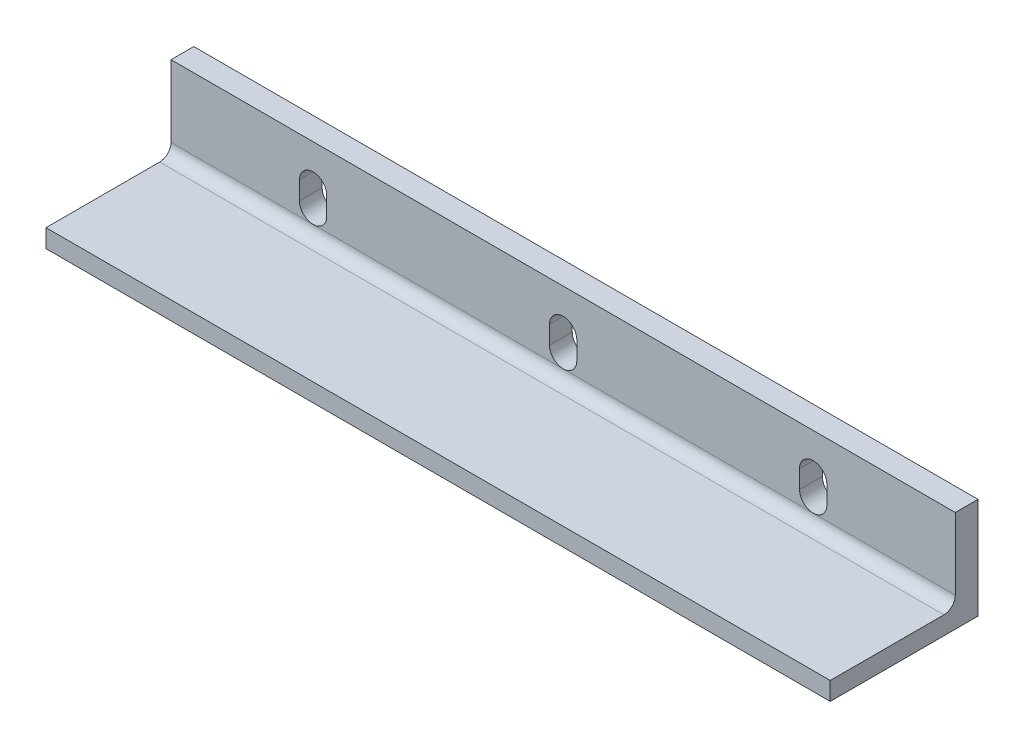
ISO-10303-21;
HEADER;
FILE_DESCRIPTION(('STEP AP214'),'2;1');
FILE_NAME('part.step','',(''),(''),'','','');
FILE_SCHEMA(('AUTOMOTIVE_DESIGN { 1 0 10303 214 1 1 1 1 }'));
ENDSEC;
DATA;
#1=APPLICATION_CONTEXT('core data for automotive mechanical design processes');
#2=APPLICATION_PROTOCOL_DEFINITION('international standard','automotive_design',2000,#1);
#3=PRODUCT_CONTEXT('',#1,'mechanical');
#4=PRODUCT('Part','Part','',(#3));
#5=PRODUCT_RELATED_PRODUCT_CATEGORY('part','',(#4));
#6=PRODUCT_DEFINITION_FORMATION('','',#4);
#7=PRODUCT_DEFINITION_CONTEXT('part definition',#1,'design');
#8=PRODUCT_DEFINITION('design','',#6,#7);
#9=PRODUCT_DEFINITION_SHAPE('','',#8);
#10=(LENGTH_UNIT() NAMED_UNIT(*) SI_UNIT(.MILLI.,.METRE.));
#11=(NAMED_UNIT(*) PLANE_ANGLE_UNIT() SI_UNIT($,.RADIAN.));
#12=(NAMED_UNIT(*) SI_UNIT($,.STERADIAN.) SOLID_ANGLE_UNIT());
#13=UNCERTAINTY_MEASURE_WITH_UNIT(LENGTH_MEASURE(1.E-05),#10,'distance_accuracy_value','');
#14=(GEOMETRIC_REPRESENTATION_CONTEXT(3) GLOBAL_UNCERTAINTY_ASSIGNED_CONTEXT((#13)) GLOBAL_UNIT_ASSIGNED_CONTEXT((#10,
#11,#12)) REPRESENTATION_CONTEXT('',''));
#15=CARTESIAN_POINT('',(0.,0.,0.));
#16=DIRECTION('',(0.,0.,1.));
#17=DIRECTION('',(1.,0.,0.));
#18=AXIS2_PLACEMENT_3D('',#15,#16,#17);
#19=CARTESIAN_POINT('',(-34.5,8.9,-4.5));
#20=DIRECTION('',(0.,0.,-1.));
#21=DIRECTION('',(-1.,0.,0.));
#22=AXIS2_PLACEMENT_3D('',#19,#20,#21);
#23=PLANE('',#22);
#24=DIRECTION('',(1.,0.,0.));
#25=VECTOR('',#24,1.);
#26=CARTESIAN_POINT('',(34.5,2.6,-4.5));
#27=LINE('',#26,#25);
#28=CARTESIAN_POINT('',(-34.5,2.6,-4.5));
#29=VERTEX_POINT('',#28);
#30=CARTESIAN_POINT('',(-22.,2.6,-4.5));
#31=VERTEX_POINT('',#30);
#32=EDGE_CURVE('E594',#29,#31,#27,.T.);
#33=ORIENTED_EDGE('',*,*,#32,.T.);
#34=CARTESIAN_POINT('',(-22.,3.8,-4.5));
#35=DIRECTION('',(0.,0.,1.));
#36=DIRECTION('',(1.,0.,0.));
#37=AXIS2_PLACEMENT_3D('',#34,#35,#36);
#38=CIRCLE('',#37,1.2);
#39=CARTESIAN_POINT('',(-23.2,3.8,-4.5));
#40=VERTEX_POINT('',#39);
#41=EDGE_CURVE('E425',#40,#31,#38,.T.);
#42=ORIENTED_EDGE('',*,*,#41,.F.);
#43=DIRECTION('',(0.,1.,0.));
#44=VECTOR('',#43,1.);
#45=CARTESIAN_POINT('',(-23.2,3.8,-4.5));
#46=LINE('',#45,#44);
#47=CARTESIAN_POINT('',(-23.2,5.4,-4.5));
#48=VERTEX_POINT('',#47);
#49=EDGE_CURVE('E418',#40,#48,#46,.T.);
#50=ORIENTED_EDGE('',*,*,#49,.T.);
#51=CARTESIAN_POINT('',(-22.,5.4,-4.5));
#52=DIRECTION('',(0.,0.,1.));
#53=DIRECTION('',(1.,0.,0.));
#54=AXIS2_PLACEMENT_3D('',#51,#52,#53);
#55=CIRCLE('',#54,1.2);
#56=CARTESIAN_POINT('',(-20.7999999999999,5.4,-4.5));
#57=VERTEX_POINT('',#56);
#58=EDGE_CURVE('E434',#57,#48,#55,.T.);
#59=ORIENTED_EDGE('',*,*,#58,.F.);
#60=DIRECTION('',(0.,1.,0.));
#61=VECTOR('',#60,1.);
#62=CARTESIAN_POINT('',(-20.7999999999999,3.8,-4.5));
#63=LINE('',#62,#61);
#64=CARTESIAN_POINT('',(-20.8,3.8,-4.5));
#65=VERTEX_POINT('',#64);
#66=EDGE_CURVE('E411',#65,#57,#63,.T.);
#67=ORIENTED_EDGE('',*,*,#66,.F.);
#68=EDGE_CURVE('E415',#31,#65,#38,.T.);
#69=ORIENTED_EDGE('',*,*,#68,.F.);
#70=CARTESIAN_POINT('',(0.,2.6,-4.5));
#71=VERTEX_POINT('',#70);
#72=EDGE_CURVE('E599',#31,#71,#27,.T.);
#73=ORIENTED_EDGE('',*,*,#72,.T.);
#74=CARTESIAN_POINT('',(0.,3.8,-4.5));
#75=DIRECTION('',(0.,0.,1.));
#76=DIRECTION('',(1.,0.,0.));
#77=AXIS2_PLACEMENT_3D('',#74,#75,#76);
#78=CIRCLE('',#77,1.2);
#79=CARTESIAN_POINT('',(-1.20000000000006,3.8,-4.5));
#80=VERTEX_POINT('',#79);
#81=EDGE_CURVE('E272',#80,#71,#78,.T.);
#82=ORIENTED_EDGE('',*,*,#81,.F.);
#83=DIRECTION('',(0.,1.,0.));
#84=VECTOR('',#83,1.);
#85=CARTESIAN_POINT('',(-1.2,3.8,-4.5));
#86=LINE('',#85,#84);
#87=CARTESIAN_POINT('',(-1.2,5.4,-4.5));
#88=VERTEX_POINT('',#87);
#89=EDGE_CURVE('E454',#80,#88,#86,.T.);
#90=ORIENTED_EDGE('',*,*,#89,.T.);
#91=CARTESIAN_POINT('',(0.,5.4,-4.5));
#92=DIRECTION('',(0.,0.,1.));
#93=DIRECTION('',(1.,0.,0.));
#94=AXIS2_PLACEMENT_3D('',#91,#92,#93);
#95=CIRCLE('',#94,1.2);
#96=CARTESIAN_POINT('',(1.20000000000006,5.4,-4.5));
#97=VERTEX_POINT('',#96);
#98=EDGE_CURVE('E474',#97,#88,#95,.T.);
#99=ORIENTED_EDGE('',*,*,#98,.F.);
#100=DIRECTION('',(0.,1.,0.));
#101=VECTOR('',#100,1.);
#102=CARTESIAN_POINT('',(1.20000000000006,3.8,-4.5));
#103=LINE('',#102,#101);
#104=CARTESIAN_POINT('',(1.2,3.8,-4.5));
#105=VERTEX_POINT('',#104);
#106=EDGE_CURVE('E444',#105,#97,#103,.T.);
#107=ORIENTED_EDGE('',*,*,#106,.F.);
#108=EDGE_CURVE('E13',#71,#105,#78,.T.);
#109=ORIENTED_EDGE('',*,*,#108,.F.);
#110=CARTESIAN_POINT('',(22.,2.6,-4.5));
#111=VERTEX_POINT('',#110);
#112=EDGE_CURVE('E623',#71,#111,#27,.T.);
#113=ORIENTED_EDGE('',*,*,#112,.T.);
#114=CARTESIAN_POINT('',(22.,3.80000000000001,-4.5));
#115=DIRECTION('',(0.,0.,1.));
#116=DIRECTION('',(1.,0.,0.));
#117=AXIS2_PLACEMENT_3D('',#114,#115,#116);
#118=CIRCLE('',#117,1.2);
#119=CARTESIAN_POINT('',(20.7999999999999,3.80000000000001,-4.5));
#120=VERTEX_POINT('',#119);
#121=EDGE_CURVE('E504',#120,#111,#118,.T.);
#122=ORIENTED_EDGE('',*,*,#121,.F.);
#123=DIRECTION('',(0.,1.,0.));
#124=VECTOR('',#123,1.);
#125=CARTESIAN_POINT('',(20.8,3.80000000000001,-4.5));
#126=LINE('',#125,#124);
#127=CARTESIAN_POINT('',(20.8,5.40000000000001,-4.5));
#128=VERTEX_POINT('',#127);
#129=EDGE_CURVE('E495',#120,#128,#126,.T.);
#130=ORIENTED_EDGE('',*,*,#129,.T.);
#131=CARTESIAN_POINT('',(22.,5.40000000000001,-4.5));
#132=DIRECTION('',(0.,0.,1.));
#133=DIRECTION('',(1.,0.,0.));
#134=AXIS2_PLACEMENT_3D('',#131,#132,#133);
#135=CIRCLE('',#134,1.2);
#136=CARTESIAN_POINT('',(23.2000000000001,5.40000000000001,-4.5));
#137=VERTEX_POINT('',#136);
#138=EDGE_CURVE('E520',#137,#128,#135,.T.);
#139=ORIENTED_EDGE('',*,*,#138,.F.);
#140=DIRECTION('',(0.,1.,0.));
#141=VECTOR('',#140,1.);
#142=CARTESIAN_POINT('',(23.2000000000001,3.80000000000001,-4.5));
#143=LINE('',#142,#141);
#144=CARTESIAN_POINT('',(23.2,3.80000000000001,-4.5));
#145=VERTEX_POINT('',#144);
#146=EDGE_CURVE('E485',#145,#137,#143,.T.);
#147=ORIENTED_EDGE('',*,*,#146,.F.);
#148=EDGE_CURVE('E503',#111,#145,#118,.T.);
#149=ORIENTED_EDGE('',*,*,#148,.F.);
#150=CARTESIAN_POINT('',(34.5,2.6,-4.5));
#151=VERTEX_POINT('',#150);
#152=EDGE_CURVE('E593',#111,#151,#27,.T.);
#153=ORIENTED_EDGE('',*,*,#152,.T.);
#154=DIRECTION('',(0.,-1.,0.));
#155=VECTOR('',#154,1.);
#156=CARTESIAN_POINT('',(34.5,8.9,-4.5));
#157=LINE('',#156,#155);
#158=CARTESIAN_POINT('',(34.5,8.9,-4.5));
#159=VERTEX_POINT('',#158);
#160=EDGE_CURVE('E546',#159,#151,#157,.T.);
#161=ORIENTED_EDGE('',*,*,#160,.F.);
#162=DIRECTION('',(1.,0.,0.));
#163=VECTOR('',#162,1.);
#164=CARTESIAN_POINT('',(-34.5,8.9,-4.5));
#165=LINE('',#164,#163);
#166=CARTESIAN_POINT('',(-34.5,8.9,-4.5));
#167=VERTEX_POINT('',#166);
#168=EDGE_CURVE('E535',#167,#159,#165,.T.);
#169=ORIENTED_EDGE('',*,*,#168,.F.);
#170=DIRECTION('',(0.,-1.,0.));
#171=VECTOR('',#170,1.);
#172=CARTESIAN_POINT('',(-34.5,8.9,-4.5));
#173=LINE('',#172,#171);
#174=EDGE_CURVE('E550',#167,#29,#173,.T.);
#175=ORIENTED_EDGE('',*,*,#174,.T.);
#176=EDGE_LOOP('',(#33,#42,#50,#59,#67,#69,#73,#82,#90,#99,#107,#109,#113,#122,#130,#139,#147,
#149,#153,#161,#169,#175));
#177=FACE_BOUND('',#176,.T.);
#178=ADVANCED_FACE('F261',(#177),#23,.F.);
#179=CARTESIAN_POINT('',(0.,1.6,0.));
#180=DIRECTION('',(0.,-1.,0.));
#181=DIRECTION('',(0.,0.,-1.));
#182=AXIS2_PLACEMENT_3D('',#179,#180,#181);
#183=PLANE('',#182);
#184=DIRECTION('',(0.,0.,-1.));
#185=VECTOR('',#184,1.);
#186=CARTESIAN_POINT('',(34.5,1.6,6.5));
#187=LINE('',#186,#185);
#188=CARTESIAN_POINT('',(34.5,1.6,6.5));
#189=VERTEX_POINT('',#188);
#190=CARTESIAN_POINT('',(34.5,1.6,-3.49999999999999));
#191=VERTEX_POINT('',#190);
#192=EDGE_CURVE('E555',#189,#191,#187,.T.);
#193=ORIENTED_EDGE('',*,*,#192,.T.);
#194=DIRECTION('',(1.,0.,0.));
#195=VECTOR('',#194,1.);
#196=CARTESIAN_POINT('',(-34.5,1.6,-3.5));
#197=LINE('',#196,#195);
#198=CARTESIAN_POINT('',(-34.5,1.6,-3.5));
#199=VERTEX_POINT('',#198);
#200=EDGE_CURVE('E598',#191,#199,#197,.F.);
#201=ORIENTED_EDGE('',*,*,#200,.T.);
#202=DIRECTION('',(0.,0.,1.));
#203=VECTOR('',#202,1.);
#204=CARTESIAN_POINT('',(-34.5,1.6,6.5));
#205=LINE('',#204,#203);
#206=CARTESIAN_POINT('',(-34.5,1.6,6.5));
#207=VERTEX_POINT('',#206);
#208=EDGE_CURVE('E559',#199,#207,#205,.T.);
#209=ORIENTED_EDGE('',*,*,#208,.T.);
#210=DIRECTION('',(1.,0.,0.));
#211=VECTOR('',#210,1.);
#212=CARTESIAN_POINT('',(-34.5,1.6,6.5));
#213=LINE('',#212,#211);
#214=EDGE_CURVE('E563',#207,#189,#213,.T.);
#215=ORIENTED_EDGE('',*,*,#214,.T.);
#216=EDGE_LOOP('',(#193,#201,#209,#215));
#217=FACE_BOUND('',#216,.T.);
#218=ADVANCED_FACE('F649',(#217),#183,.F.);
#219=CARTESIAN_POINT('',(34.5,1.6,6.5));
#220=DIRECTION('',(-1.,0.,0.));
#221=DIRECTION('',(0.,0.,1.));
#222=AXIS2_PLACEMENT_3D('',#219,#220,#221);
#223=PLANE('',#222);
#224=DIRECTION('',(0.,0.,-1.));
#225=VECTOR('',#224,1.);
#226=CARTESIAN_POINT('',(34.5,0.,6.5));
#227=LINE('',#226,#225);
#228=CARTESIAN_POINT('',(34.5,0.,6.5));
#229=VERTEX_POINT('',#228);
#230=CARTESIAN_POINT('',(34.5,0.,-6.5));
#231=VERTEX_POINT('',#230);
#232=EDGE_CURVE('E554',#229,#231,#227,.T.);
#233=ORIENTED_EDGE('',*,*,#232,.T.);
#234=DIRECTION('',(0.,-1.,0.));
#235=VECTOR('',#234,1.);
#236=CARTESIAN_POINT('',(34.5,1.6,-6.5));
#237=LINE('',#236,#235);
#238=CARTESIAN_POINT('',(34.5,8.9,-6.5));
#239=VERTEX_POINT('',#238);
#240=EDGE_CURVE('E589',#239,#231,#237,.T.);
#241=ORIENTED_EDGE('',*,*,#240,.F.);
#242=DIRECTION('',(0.,0.,-1.));
#243=VECTOR('',#242,1.);
#244=CARTESIAN_POINT('',(34.5,8.9,-6.5));
#245=LINE('',#244,#243);
#246=EDGE_CURVE('E538',#159,#239,#245,.T.);
#247=ORIENTED_EDGE('',*,*,#246,.F.);
#248=ORIENTED_EDGE('',*,*,#160,.T.);
#249=CARTESIAN_POINT('',(34.5,2.6,-3.5));
#250=DIRECTION('',(-1.,0.,0.));
#251=DIRECTION('',(0.,0.,1.));
#252=AXIS2_PLACEMENT_3D('',#249,#250,#251);
#253=CIRCLE('',#252,1.);
#254=EDGE_CURVE('E601',#151,#191,#253,.T.);
#255=ORIENTED_EDGE('',*,*,#254,.T.);
#256=ORIENTED_EDGE('',*,*,#192,.F.);
#257=DIRECTION('',(0.,-1.,0.));
#258=VECTOR('',#257,1.);
#259=CARTESIAN_POINT('',(34.5,1.6,6.5));
#260=LINE('',#259,#258);
#261=EDGE_CURVE('E566',#189,#229,#260,.T.);
#262=ORIENTED_EDGE('',*,*,#261,.T.);
#263=EDGE_LOOP('',(#233,#241,#247,#248,#255,#256,#262));
#264=FACE_BOUND('',#263,.T.);
#265=ADVANCED_FACE('F634',(#264),#223,.F.);
#266=CARTESIAN_POINT('',(-34.5,1.6,-6.5));
#267=DIRECTION('',(0.,0.,1.));
#268=DIRECTION('',(1.,0.,0.));
#269=AXIS2_PLACEMENT_3D('',#266,#267,#268);
#270=PLANE('',#269);
#271=DIRECTION('',(0.,1.,0.));
#272=VECTOR('',#271,1.);
#273=CARTESIAN_POINT('',(-23.2,3.8,-6.5));
#274=LINE('',#273,#272);
#275=CARTESIAN_POINT('',(-23.2,3.8,-6.5));
#276=VERTEX_POINT('',#275);
#277=CARTESIAN_POINT('',(-23.2,5.4,-6.5));
#278=VERTEX_POINT('',#277);
#279=EDGE_CURVE('E410',#276,#278,#274,.T.);
#280=ORIENTED_EDGE('',*,*,#279,.F.);
#281=CARTESIAN_POINT('',(-22.,3.8,-6.5));
#282=DIRECTION('',(0.,0.,1.));
#283=DIRECTION('',(1.,0.,0.));
#284=AXIS2_PLACEMENT_3D('',#281,#282,#283);
#285=CIRCLE('',#284,1.2);
#286=CARTESIAN_POINT('',(-20.8,3.8,-6.5));
#287=VERTEX_POINT('',#286);
#288=EDGE_CURVE('E286',#276,#287,#285,.T.);
#289=ORIENTED_EDGE('',*,*,#288,.T.);
#290=DIRECTION('',(0.,1.,0.));
#291=VECTOR('',#290,1.);
#292=CARTESIAN_POINT('',(-20.8,3.8,-6.5));
#293=LINE('',#292,#291);
#294=CARTESIAN_POINT('',(-20.8,5.4,-6.5));
#295=VERTEX_POINT('',#294);
#296=EDGE_CURVE('E403',#287,#295,#293,.T.);
#297=ORIENTED_EDGE('',*,*,#296,.T.);
#298=CARTESIAN_POINT('',(-22.,5.4,-6.5));
#299=DIRECTION('',(0.,0.,1.));
#300=DIRECTION('',(1.,0.,0.));
#301=AXIS2_PLACEMENT_3D('',#298,#299,#300);
#302=CIRCLE('',#301,1.2);
#303=EDGE_CURVE('E438',#295,#278,#302,.T.);
#304=ORIENTED_EDGE('',*,*,#303,.T.);
#305=EDGE_LOOP('',(#280,#289,#297,#304));
#306=FACE_BOUND('',#305,.T.);
#307=DIRECTION('',(0.,1.,0.));
#308=VECTOR('',#307,1.);
#309=CARTESIAN_POINT('',(1.2,3.8,-6.5));
#310=LINE('',#309,#308);
#311=CARTESIAN_POINT('',(1.2,3.8,-6.5));
#312=VERTEX_POINT('',#311);
#313=CARTESIAN_POINT('',(1.2,5.4,-6.5));
#314=VERTEX_POINT('',#313);
#315=EDGE_CURVE('E447',#312,#314,#310,.T.);
#316=ORIENTED_EDGE('',*,*,#315,.T.);
#317=CARTESIAN_POINT('',(0.,5.4,-6.5));
#318=DIRECTION('',(0.,0.,1.));
#319=DIRECTION('',(1.,0.,0.));
#320=AXIS2_PLACEMENT_3D('',#317,#318,#319);
#321=CIRCLE('',#320,1.2);
#322=CARTESIAN_POINT('',(-1.2,5.4,-6.5));
#323=VERTEX_POINT('',#322);
#324=EDGE_CURVE('E478',#314,#323,#321,.T.);
#325=ORIENTED_EDGE('',*,*,#324,.T.);
#326=DIRECTION('',(0.,1.,0.));
#327=VECTOR('',#326,1.);
#328=CARTESIAN_POINT('',(-1.2,3.8,-6.5));
#329=LINE('',#328,#327);
#330=CARTESIAN_POINT('',(-1.2,3.8,-6.5));
#331=VERTEX_POINT('',#330);
#332=EDGE_CURVE('E451',#331,#323,#329,.T.);
#333=ORIENTED_EDGE('',*,*,#332,.F.);
#334=CARTESIAN_POINT('',(0.,3.8,-6.5));
#335=DIRECTION('',(0.,0.,1.));
#336=DIRECTION('',(1.,0.,0.));
#337=AXIS2_PLACEMENT_3D('',#334,#335,#336);
#338=CIRCLE('',#337,1.2);
#339=EDGE_CURVE('E463',#331,#312,#338,.T.);
#340=ORIENTED_EDGE('',*,*,#339,.T.);
#341=EDGE_LOOP('',(#316,#325,#333,#340));
#342=FACE_BOUND('',#341,.T.);
#343=CARTESIAN_POINT('',(22.,3.80000000000001,-6.5));
#344=DIRECTION('',(0.,0.,1.));
#345=DIRECTION('',(1.,0.,0.));
#346=AXIS2_PLACEMENT_3D('',#343,#344,#345);
#347=CIRCLE('',#346,1.2);
#348=CARTESIAN_POINT('',(20.8,3.80000000000001,-6.5));
#349=VERTEX_POINT('',#348);
#350=CARTESIAN_POINT('',(23.2,3.80000000000001,-6.5));
#351=VERTEX_POINT('',#350);
#352=EDGE_CURVE('E508',#349,#351,#347,.T.);
#353=ORIENTED_EDGE('',*,*,#352,.T.);
#354=DIRECTION('',(0.,1.,0.));
#355=VECTOR('',#354,1.);
#356=CARTESIAN_POINT('',(23.2,3.80000000000001,-6.5));
#357=LINE('',#356,#355);
#358=CARTESIAN_POINT('',(23.2,5.40000000000001,-6.5));
#359=VERTEX_POINT('',#358);
#360=EDGE_CURVE('E488',#351,#359,#357,.T.);
#361=ORIENTED_EDGE('',*,*,#360,.T.);
#362=CARTESIAN_POINT('',(22.,5.40000000000001,-6.5));
#363=DIRECTION('',(0.,0.,1.));
#364=DIRECTION('',(1.,0.,0.));
#365=AXIS2_PLACEMENT_3D('',#362,#363,#364);
#366=CIRCLE('',#365,1.2);
#367=CARTESIAN_POINT('',(20.8,5.40000000000001,-6.5));
#368=VERTEX_POINT('',#367);
#369=EDGE_CURVE('E524',#359,#368,#366,.T.);
#370=ORIENTED_EDGE('',*,*,#369,.T.);
#371=DIRECTION('',(0.,1.,0.));
#372=VECTOR('',#371,1.);
#373=CARTESIAN_POINT('',(20.8,3.80000000000001,-6.5));
#374=LINE('',#373,#372);
#375=EDGE_CURVE('E492',#349,#368,#374,.T.);
#376=ORIENTED_EDGE('',*,*,#375,.F.);
#377=EDGE_LOOP('',(#353,#361,#370,#376));
#378=FACE_BOUND('',#377,.T.);
#379=DIRECTION('',(-1.,0.,0.));
#380=VECTOR('',#379,1.);
#381=CARTESIAN_POINT('',(-34.5,0.,-6.5));
#382=LINE('',#381,#380);
#383=CARTESIAN_POINT('',(-34.5,0.,-6.5));
#384=VERTEX_POINT('',#383);
#385=EDGE_CURVE('E570',#231,#384,#382,.T.);
#386=ORIENTED_EDGE('',*,*,#385,.T.);
#387=DIRECTION('',(0.,-1.,0.));
#388=VECTOR('',#387,1.);
#389=CARTESIAN_POINT('',(-34.5,1.6,-6.5));
#390=LINE('',#389,#388);
#391=CARTESIAN_POINT('',(-34.5,8.9,-6.5));
#392=VERTEX_POINT('',#391);
#393=EDGE_CURVE('E585',#392,#384,#390,.T.);
#394=ORIENTED_EDGE('',*,*,#393,.F.);
#395=DIRECTION('',(-1.,0.,0.));
#396=VECTOR('',#395,1.);
#397=CARTESIAN_POINT('',(-34.5,8.9,-6.5));
#398=LINE('',#397,#396);
#399=EDGE_CURVE('E542',#239,#392,#398,.T.);
#400=ORIENTED_EDGE('',*,*,#399,.F.);
#401=ORIENTED_EDGE('',*,*,#240,.T.);
#402=EDGE_LOOP('',(#386,#394,#400,#401));
#403=FACE_BOUND('',#402,.T.);
#404=ADVANCED_FACE('F421',(#306,#342,#378,#403),#270,.F.);
#405=CARTESIAN_POINT('',(-34.5,1.6,6.5));
#406=DIRECTION('',(1.,0.,0.));
#407=DIRECTION('',(0.,0.,-1.));
#408=AXIS2_PLACEMENT_3D('',#405,#406,#407);
#409=PLANE('',#408);
#410=DIRECTION('',(0.,0.,1.));
#411=VECTOR('',#410,1.);
#412=CARTESIAN_POINT('',(-34.5,0.,6.5));
#413=LINE('',#412,#411);
#414=CARTESIAN_POINT('',(-34.5,0.,6.5));
#415=VERTEX_POINT('',#414);
#416=EDGE_CURVE('E573',#384,#415,#413,.T.);
#417=ORIENTED_EDGE('',*,*,#416,.T.);
#418=DIRECTION('',(0.,-1.,0.));
#419=VECTOR('',#418,1.);
#420=CARTESIAN_POINT('',(-34.5,1.6,6.5));
#421=LINE('',#420,#419);
#422=EDGE_CURVE('E581',#207,#415,#421,.T.);
#423=ORIENTED_EDGE('',*,*,#422,.F.);
#424=ORIENTED_EDGE('',*,*,#208,.F.);
#425=CARTESIAN_POINT('',(-34.5,2.6,-3.5));
#426=DIRECTION('',(1.,0.,0.));
#427=DIRECTION('',(0.,0.,-1.));
#428=AXIS2_PLACEMENT_3D('',#425,#426,#427);
#429=CIRCLE('',#428,1.);
#430=EDGE_CURVE('E265',#199,#29,#429,.T.);
#431=ORIENTED_EDGE('',*,*,#430,.T.);
#432=ORIENTED_EDGE('',*,*,#174,.F.);
#433=DIRECTION('',(0.,0.,1.));
#434=VECTOR('',#433,1.);
#435=CARTESIAN_POINT('',(-34.5,8.9,-6.5));
#436=LINE('',#435,#434);
#437=EDGE_CURVE('E531',#392,#167,#436,.T.);
#438=ORIENTED_EDGE('',*,*,#437,.F.);
#439=ORIENTED_EDGE('',*,*,#393,.T.);
#440=EDGE_LOOP('',(#417,#423,#424,#431,#432,#438,#439));
#441=FACE_BOUND('',#440,.T.);
#442=ADVANCED_FACE('F611',(#441),#409,.F.);
#443=CARTESIAN_POINT('',(-34.5,1.6,6.5));
#444=DIRECTION('',(0.,0.,-1.));
#445=DIRECTION('',(-1.,0.,0.));
#446=AXIS2_PLACEMENT_3D('',#443,#444,#445);
#447=PLANE('',#446);
#448=DIRECTION('',(1.,0.,0.));
#449=VECTOR('',#448,1.);
#450=CARTESIAN_POINT('',(-34.5,0.,6.5));
#451=LINE('',#450,#449);
#452=EDGE_CURVE('E560',#415,#229,#451,.T.);
#453=ORIENTED_EDGE('',*,*,#452,.T.);
#454=ORIENTED_EDGE('',*,*,#261,.F.);
#455=ORIENTED_EDGE('',*,*,#214,.F.);
#456=ORIENTED_EDGE('',*,*,#422,.T.);
#457=EDGE_LOOP('',(#453,#454,#455,#456));
#458=FACE_BOUND('',#457,.T.);
#459=ADVANCED_FACE('F646',(#458),#447,.F.);
#460=CARTESIAN_POINT('',(0.,0.,0.));
#461=DIRECTION('',(0.,-1.,0.));
#462=DIRECTION('',(0.,0.,-1.));
#463=AXIS2_PLACEMENT_3D('',#460,#461,#462);
#464=PLANE('',#463);
#465=ORIENTED_EDGE('',*,*,#232,.F.);
#466=ORIENTED_EDGE('',*,*,#452,.F.);
#467=ORIENTED_EDGE('',*,*,#416,.F.);
#468=ORIENTED_EDGE('',*,*,#385,.F.);
#469=EDGE_LOOP('',(#465,#466,#467,#468));
#470=FACE_BOUND('',#469,.T.);
#471=ADVANCED_FACE('F643',(#470),#464,.T.);
#472=CARTESIAN_POINT('',(0.,8.9,0.));
#473=DIRECTION('',(0.,1.,0.));
#474=DIRECTION('',(0.,0.,1.));
#475=AXIS2_PLACEMENT_3D('',#472,#473,#474);
#476=PLANE('',#475);
#477=ORIENTED_EDGE('',*,*,#437,.T.);
#478=ORIENTED_EDGE('',*,*,#168,.T.);
#479=ORIENTED_EDGE('',*,*,#246,.T.);
#480=ORIENTED_EDGE('',*,*,#399,.T.);
#481=EDGE_LOOP('',(#477,#478,#479,#480));
#482=FACE_BOUND('',#481,.T.);
#483=ADVANCED_FACE('F637',(#482),#476,.T.);
#484=CARTESIAN_POINT('',(-34.5,2.6,-3.5));
#485=DIRECTION('',(-1.,0.,0.));
#486=DIRECTION('',(0.,0.,1.));
#487=AXIS2_PLACEMENT_3D('',#484,#485,#486);
#488=CYLINDRICAL_SURFACE('',#487,1.);
#489=ORIENTED_EDGE('',*,*,#430,.F.);
#490=ORIENTED_EDGE('',*,*,#200,.F.);
#491=ORIENTED_EDGE('',*,*,#254,.F.);
#492=ORIENTED_EDGE('',*,*,#152,.F.);
#493=ORIENTED_EDGE('',*,*,#112,.F.);
#494=ORIENTED_EDGE('',*,*,#72,.F.);
#495=ORIENTED_EDGE('',*,*,#32,.F.);
#496=EDGE_LOOP('',(#489,#490,#491,#492,#493,#494,#495));
#497=FACE_BOUND('',#496,.T.);
#498=ADVANCED_FACE('F263',(#497),#488,.F.);
#499=CARTESIAN_POINT('',(22.,5.40000000000001,-4.5));
#500=DIRECTION('',(0.,0.,1.));
#501=DIRECTION('',(1.,0.,0.));
#502=AXIS2_PLACEMENT_3D('',#499,#500,#501);
#503=CYLINDRICAL_SURFACE('',#502,1.2);
#504=ORIENTED_EDGE('',*,*,#369,.F.);
#505=DIRECTION('',(0.,0.,-1.));
#506=VECTOR('',#505,1.);
#507=CARTESIAN_POINT('',(23.2,5.40000000000001,-6.5));
#508=LINE('',#507,#506);
#509=EDGE_CURVE('E516',#137,#359,#508,.T.);
#510=ORIENTED_EDGE('',*,*,#509,.F.);
#511=ORIENTED_EDGE('',*,*,#138,.T.);
#512=DIRECTION('',(0.,0.,1.));
#513=VECTOR('',#512,1.);
#514=CARTESIAN_POINT('',(20.8,5.40000000000001,-4.5));
#515=LINE('',#514,#513);
#516=EDGE_CURVE('E528',#368,#128,#515,.T.);
#517=ORIENTED_EDGE('',*,*,#516,.F.);
#518=EDGE_LOOP('',(#504,#510,#511,#517));
#519=FACE_BOUND('',#518,.T.);
#520=ADVANCED_FACE('F694',(#519),#503,.F.);
#521=CARTESIAN_POINT('',(22.,3.80000000000001,-4.5));
#522=DIRECTION('',(0.,0.,1.));
#523=DIRECTION('',(1.,0.,0.));
#524=AXIS2_PLACEMENT_3D('',#521,#522,#523);
#525=CYLINDRICAL_SURFACE('',#524,1.2);
#526=ORIENTED_EDGE('',*,*,#121,.T.);
#527=ORIENTED_EDGE('',*,*,#148,.T.);
#528=DIRECTION('',(0.,0.,-1.));
#529=VECTOR('',#528,1.);
#530=CARTESIAN_POINT('',(23.2,3.80000000000001,-6.5));
#531=LINE('',#530,#529);
#532=EDGE_CURVE('E499',#145,#351,#531,.T.);
#533=ORIENTED_EDGE('',*,*,#532,.T.);
#534=ORIENTED_EDGE('',*,*,#352,.F.);
#535=DIRECTION('',(0.,0.,1.));
#536=VECTOR('',#535,1.);
#537=CARTESIAN_POINT('',(20.8,3.80000000000001,-4.5));
#538=LINE('',#537,#536);
#539=EDGE_CURVE('E512',#120,#349,#538,.F.);
#540=ORIENTED_EDGE('',*,*,#539,.F.);
#541=EDGE_LOOP('',(#526,#527,#533,#534,#540));
#542=FACE_BOUND('',#541,.T.);
#543=ADVANCED_FACE('F700',(#542),#525,.F.);
#544=CARTESIAN_POINT('',(20.8,3.80000000000001,-4.5));
#545=DIRECTION('',(-1.,0.,0.));
#546=DIRECTION('',(0.,0.,1.));
#547=AXIS2_PLACEMENT_3D('',#544,#545,#546);
#548=PLANE('',#547);
#549=ORIENTED_EDGE('',*,*,#516,.T.);
#550=ORIENTED_EDGE('',*,*,#129,.F.);
#551=ORIENTED_EDGE('',*,*,#539,.T.);
#552=ORIENTED_EDGE('',*,*,#375,.T.);
#553=EDGE_LOOP('',(#549,#550,#551,#552));
#554=FACE_BOUND('',#553,.T.);
#555=ADVANCED_FACE('F708',(#554),#548,.F.);
#556=CARTESIAN_POINT('',(23.2,3.80000000000001,-6.5));
#557=DIRECTION('',(1.,0.,0.));
#558=DIRECTION('',(0.,0.,-1.));
#559=AXIS2_PLACEMENT_3D('',#556,#557,#558);
#560=PLANE('',#559);
#561=ORIENTED_EDGE('',*,*,#509,.T.);
#562=ORIENTED_EDGE('',*,*,#360,.F.);
#563=ORIENTED_EDGE('',*,*,#532,.F.);
#564=ORIENTED_EDGE('',*,*,#146,.T.);
#565=EDGE_LOOP('',(#561,#562,#563,#564));
#566=FACE_BOUND('',#565,.T.);
#567=ADVANCED_FACE('F716',(#566),#560,.F.);
#568=CARTESIAN_POINT('',(0.,5.4,-4.5));
#569=DIRECTION('',(0.,0.,1.));
#570=DIRECTION('',(1.,0.,0.));
#571=AXIS2_PLACEMENT_3D('',#568,#569,#570);
#572=CYLINDRICAL_SURFACE('',#571,1.2);
#573=ORIENTED_EDGE('',*,*,#324,.F.);
#574=DIRECTION('',(0.,0.,-1.));
#575=VECTOR('',#574,1.);
#576=CARTESIAN_POINT('',(1.2,5.4,-6.5));
#577=LINE('',#576,#575);
#578=EDGE_CURVE('E470',#97,#314,#577,.T.);
#579=ORIENTED_EDGE('',*,*,#578,.F.);
#580=ORIENTED_EDGE('',*,*,#98,.T.);
#581=DIRECTION('',(0.,0.,1.));
#582=VECTOR('',#581,1.);
#583=CARTESIAN_POINT('',(-1.2,5.4,-4.5));
#584=LINE('',#583,#582);
#585=EDGE_CURVE('E482',#323,#88,#584,.T.);
#586=ORIENTED_EDGE('',*,*,#585,.F.);
#587=EDGE_LOOP('',(#573,#579,#580,#586));
#588=FACE_BOUND('',#587,.T.);
#589=ADVANCED_FACE('F724',(#588),#572,.F.);
#590=CARTESIAN_POINT('',(0.,3.8,-4.5));
#591=DIRECTION('',(0.,0.,1.));
#592=DIRECTION('',(1.,0.,0.));
#593=AXIS2_PLACEMENT_3D('',#590,#591,#592);
#594=CYLINDRICAL_SURFACE('',#593,1.2);
#595=ORIENTED_EDGE('',*,*,#81,.T.);
#596=ORIENTED_EDGE('',*,*,#108,.T.);
#597=DIRECTION('',(0.,0.,-1.));
#598=VECTOR('',#597,1.);
#599=CARTESIAN_POINT('',(1.2,3.8,-6.5));
#600=LINE('',#599,#598);
#601=EDGE_CURVE('E458',#105,#312,#600,.T.);
#602=ORIENTED_EDGE('',*,*,#601,.T.);
#603=ORIENTED_EDGE('',*,*,#339,.F.);
#604=DIRECTION('',(0.,0.,1.));
#605=VECTOR('',#604,1.);
#606=CARTESIAN_POINT('',(-1.2,3.8,-4.5));
#607=LINE('',#606,#605);
#608=EDGE_CURVE('E467',#80,#331,#607,.F.);
#609=ORIENTED_EDGE('',*,*,#608,.F.);
#610=EDGE_LOOP('',(#595,#596,#602,#603,#609));
#611=FACE_BOUND('',#610,.T.);
#612=ADVANCED_FACE('F732',(#611),#594,.F.);
#613=CARTESIAN_POINT('',(-1.2,3.8,-4.5));
#614=DIRECTION('',(-1.,0.,0.));
#615=DIRECTION('',(0.,0.,1.));
#616=AXIS2_PLACEMENT_3D('',#613,#614,#615);
#617=PLANE('',#616);
#618=ORIENTED_EDGE('',*,*,#585,.T.);
#619=ORIENTED_EDGE('',*,*,#89,.F.);
#620=ORIENTED_EDGE('',*,*,#608,.T.);
#621=ORIENTED_EDGE('',*,*,#332,.T.);
#622=EDGE_LOOP('',(#618,#619,#620,#621));
#623=FACE_BOUND('',#622,.T.);
#624=ADVANCED_FACE('F740',(#623),#617,.F.);
#625=CARTESIAN_POINT('',(1.2,3.8,-6.5));
#626=DIRECTION('',(1.,0.,0.));
#627=DIRECTION('',(0.,0.,-1.));
#628=AXIS2_PLACEMENT_3D('',#625,#626,#627);
#629=PLANE('',#628);
#630=ORIENTED_EDGE('',*,*,#578,.T.);
#631=ORIENTED_EDGE('',*,*,#315,.F.);
#632=ORIENTED_EDGE('',*,*,#601,.F.);
#633=ORIENTED_EDGE('',*,*,#106,.T.);
#634=EDGE_LOOP('',(#630,#631,#632,#633));
#635=FACE_BOUND('',#634,.T.);
#636=ADVANCED_FACE('F748',(#635),#629,.F.);
#637=CARTESIAN_POINT('',(-22.,5.4,-4.5));
#638=DIRECTION('',(0.,0.,1.));
#639=DIRECTION('',(1.,0.,0.));
#640=AXIS2_PLACEMENT_3D('',#637,#638,#639);
#641=CYLINDRICAL_SURFACE('',#640,1.2);
#642=ORIENTED_EDGE('',*,*,#303,.F.);
#643=DIRECTION('',(0.,0.,-1.));
#644=VECTOR('',#643,1.);
#645=CARTESIAN_POINT('',(-20.8,5.4,-6.5));
#646=LINE('',#645,#644);
#647=EDGE_CURVE('E406',#57,#295,#646,.T.);
#648=ORIENTED_EDGE('',*,*,#647,.F.);
#649=ORIENTED_EDGE('',*,*,#58,.T.);
#650=DIRECTION('',(0.,0.,1.));
#651=VECTOR('',#650,1.);
#652=CARTESIAN_POINT('',(-23.2,5.4,-4.5));
#653=LINE('',#652,#651);
#654=EDGE_CURVE('E441',#278,#48,#653,.T.);
#655=ORIENTED_EDGE('',*,*,#654,.F.);
#656=EDGE_LOOP('',(#642,#648,#649,#655));
#657=FACE_BOUND('',#656,.T.);
#658=ADVANCED_FACE('F756',(#657),#641,.F.);
#659=CARTESIAN_POINT('',(-22.,3.8,-4.5));
#660=DIRECTION('',(0.,0.,1.));
#661=DIRECTION('',(1.,0.,0.));
#662=AXIS2_PLACEMENT_3D('',#659,#660,#661);
#663=CYLINDRICAL_SURFACE('',#662,1.2);
#664=ORIENTED_EDGE('',*,*,#41,.T.);
#665=ORIENTED_EDGE('',*,*,#68,.T.);
#666=DIRECTION('',(0.,0.,-1.));
#667=VECTOR('',#666,1.);
#668=CARTESIAN_POINT('',(-20.8,3.8,-6.5));
#669=LINE('',#668,#667);
#670=EDGE_CURVE('E279',#65,#287,#669,.T.);
#671=ORIENTED_EDGE('',*,*,#670,.T.);
#672=ORIENTED_EDGE('',*,*,#288,.F.);
#673=DIRECTION('',(0.,0.,1.));
#674=VECTOR('',#673,1.);
#675=CARTESIAN_POINT('',(-23.2,3.8,-4.5));
#676=LINE('',#675,#674);
#677=EDGE_CURVE('E424',#40,#276,#676,.F.);
#678=ORIENTED_EDGE('',*,*,#677,.F.);
#679=EDGE_LOOP('',(#664,#665,#671,#672,#678));
#680=FACE_BOUND('',#679,.T.);
#681=ADVANCED_FACE('F413',(#680),#663,.F.);
#682=CARTESIAN_POINT('',(-23.2,3.8,-4.5));
#683=DIRECTION('',(-1.,0.,0.));
#684=DIRECTION('',(0.,0.,1.));
#685=AXIS2_PLACEMENT_3D('',#682,#683,#684);
#686=PLANE('',#685);
#687=ORIENTED_EDGE('',*,*,#654,.T.);
#688=ORIENTED_EDGE('',*,*,#49,.F.);
#689=ORIENTED_EDGE('',*,*,#677,.T.);
#690=ORIENTED_EDGE('',*,*,#279,.T.);
#691=EDGE_LOOP('',(#687,#688,#689,#690));
#692=FACE_BOUND('',#691,.T.);
#693=ADVANCED_FACE('F771',(#692),#686,.F.);
#694=CARTESIAN_POINT('',(-20.8,3.8,-6.5));
#695=DIRECTION('',(1.,0.,0.));
#696=DIRECTION('',(0.,0.,-1.));
#697=AXIS2_PLACEMENT_3D('',#694,#695,#696);
#698=PLANE('',#697);
#699=ORIENTED_EDGE('',*,*,#647,.T.);
#700=ORIENTED_EDGE('',*,*,#296,.F.);
#701=ORIENTED_EDGE('',*,*,#670,.F.);
#702=ORIENTED_EDGE('',*,*,#66,.T.);
#703=EDGE_LOOP('',(#699,#700,#701,#702));
#704=FACE_BOUND('',#703,.T.);
#705=ADVANCED_FACE('F404',(#704),#698,.F.);
#706=CLOSED_SHELL('',(#178,#218,#265,#404,#442,#459,#471,#483,#498,#520,#543,#555,#567,#589,
#612,#624,#636,#658,#681,#693,#705));
#707=MANIFOLD_SOLID_BREP('B2',#706);
#708=ADVANCED_BREP_SHAPE_REPRESENTATION('',(#18,#707),#14);
#709=SHAPE_DEFINITION_REPRESENTATION(#9,#708);
ENDSEC;
END-ISO-10303-21;
